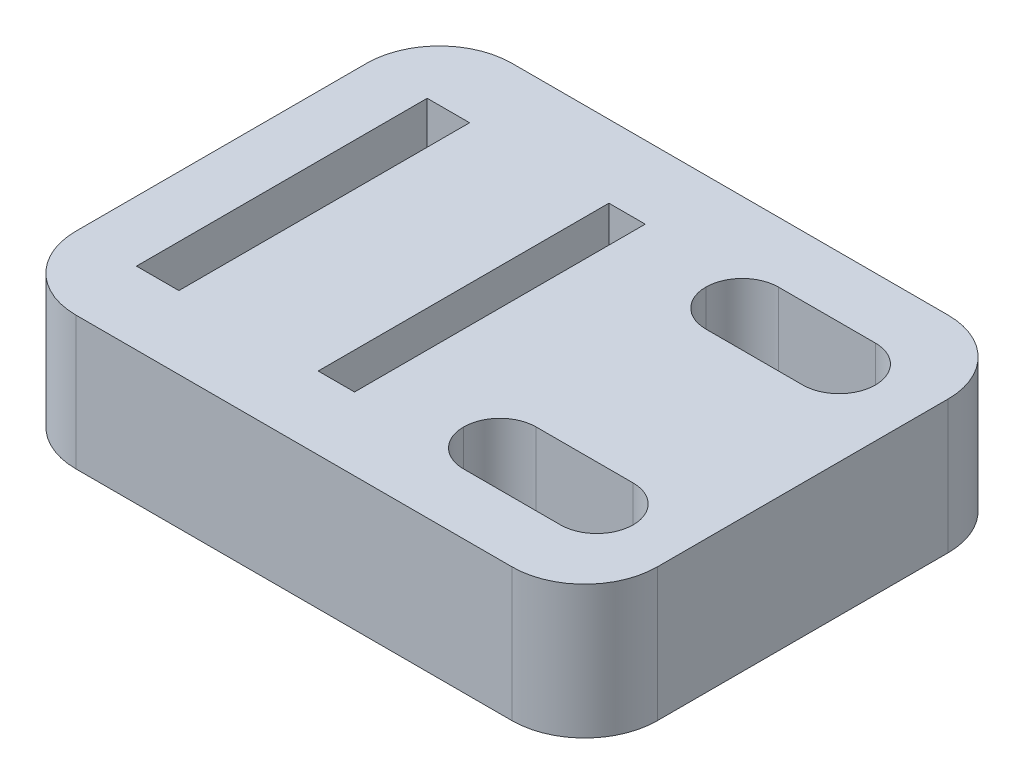
ISO-10303-21;
HEADER;
FILE_DESCRIPTION(('STEP AP214'),'2;1');
FILE_NAME('part.step','',(''),(''),'','','');
FILE_SCHEMA(('AUTOMOTIVE_DESIGN { 1 0 10303 214 1 1 1 1 }'));
ENDSEC;
DATA;
#1=APPLICATION_CONTEXT('core data for automotive mechanical design processes');
#2=APPLICATION_PROTOCOL_DEFINITION('international standard','automotive_design',2000,#1);
#3=PRODUCT_CONTEXT('',#1,'mechanical');
#4=PRODUCT('Part','Part','',(#3));
#5=PRODUCT_RELATED_PRODUCT_CATEGORY('part','',(#4));
#6=PRODUCT_DEFINITION_FORMATION('','',#4);
#7=PRODUCT_DEFINITION_CONTEXT('part definition',#1,'design');
#8=PRODUCT_DEFINITION('design','',#6,#7);
#9=PRODUCT_DEFINITION_SHAPE('','',#8);
#10=(LENGTH_UNIT() NAMED_UNIT(*) SI_UNIT(.MILLI.,.METRE.));
#11=(NAMED_UNIT(*) PLANE_ANGLE_UNIT() SI_UNIT($,.RADIAN.));
#12=(NAMED_UNIT(*) SI_UNIT($,.STERADIAN.) SOLID_ANGLE_UNIT());
#13=UNCERTAINTY_MEASURE_WITH_UNIT(LENGTH_MEASURE(1.E-05),#10,'distance_accuracy_value','');
#14=(GEOMETRIC_REPRESENTATION_CONTEXT(3) GLOBAL_UNCERTAINTY_ASSIGNED_CONTEXT((#13)) GLOBAL_UNIT_ASSIGNED_CONTEXT((#10,
#11,#12)) REPRESENTATION_CONTEXT('',''));
#15=CARTESIAN_POINT('',(0.,0.,0.));
#16=DIRECTION('',(0.,0.,1.));
#17=DIRECTION('',(1.,0.,0.));
#18=AXIS2_PLACEMENT_3D('',#15,#16,#17);
#19=CARTESIAN_POINT('',(0.,5.5,0.));
#20=DIRECTION('',(0.,1.,0.));
#21=DIRECTION('',(0.,0.,1.));
#22=AXIS2_PLACEMENT_3D('',#19,#20,#21);
#23=PLANE('',#22);
#24=DIRECTION('',(1.,0.,0.));
#25=VECTOR('',#24,1.);
#26=CARTESIAN_POINT('',(-9.,5.5,-12.5));
#27=LINE('',#26,#25);
#28=CARTESIAN_POINT('',(-7.5,5.5,-12.5));
#29=VERTEX_POINT('',#28);
#30=CARTESIAN_POINT('',(-3.5,5.5,-12.5));
#31=VERTEX_POINT('',#30);
#32=EDGE_CURVE('E424',#29,#31,#27,.T.);
#33=ORIENTED_EDGE('',*,*,#32,.F.);
#34=CARTESIAN_POINT('',(-7.5,5.5,-14.));
#35=DIRECTION('',(0.,1.,0.));
#36=DIRECTION('',(0.,0.,1.));
#37=AXIS2_PLACEMENT_3D('',#34,#35,#36);
#38=CIRCLE('',#37,1.5);
#39=CARTESIAN_POINT('',(-9.,5.5,-14.));
#40=VERTEX_POINT('',#39);
#41=EDGE_CURVE('E381',#29,#40,#38,.F.);
#42=ORIENTED_EDGE('',*,*,#41,.T.);
#43=CARTESIAN_POINT('',(-7.5,5.5,-14.));
#44=DIRECTION('',(0.,1.,0.));
#45=DIRECTION('',(0.,0.,1.));
#46=AXIS2_PLACEMENT_3D('',#43,#44,#45);
#47=CIRCLE('',#46,1.5);
#48=CARTESIAN_POINT('',(-7.5,5.5,-15.5));
#49=VERTEX_POINT('',#48);
#50=EDGE_CURVE('E371',#40,#49,#47,.F.);
#51=ORIENTED_EDGE('',*,*,#50,.T.);
#52=DIRECTION('',(-1.,0.,0.));
#53=VECTOR('',#52,1.);
#54=CARTESIAN_POINT('',(-9.,5.5,-15.5));
#55=LINE('',#54,#53);
#56=CARTESIAN_POINT('',(-3.5,5.5,-15.5));
#57=VERTEX_POINT('',#56);
#58=EDGE_CURVE('E252',#57,#49,#55,.T.);
#59=ORIENTED_EDGE('',*,*,#58,.F.);
#60=CARTESIAN_POINT('',(-3.5,5.5,-14.));
#61=DIRECTION('',(0.,1.,0.));
#62=DIRECTION('',(0.,0.,1.));
#63=AXIS2_PLACEMENT_3D('',#60,#61,#62);
#64=CIRCLE('',#63,1.5);
#65=CARTESIAN_POINT('',(-2.,5.5,-14.));
#66=VERTEX_POINT('',#65);
#67=EDGE_CURVE('E11',#57,#66,#64,.F.);
#68=ORIENTED_EDGE('',*,*,#67,.T.);
#69=CARTESIAN_POINT('',(-3.5,5.5,-14.));
#70=DIRECTION('',(0.,1.,0.));
#71=DIRECTION('',(0.,0.,1.));
#72=AXIS2_PLACEMENT_3D('',#69,#70,#71);
#73=CIRCLE('',#72,1.5);
#74=EDGE_CURVE('E407',#66,#31,#73,.F.);
#75=ORIENTED_EDGE('',*,*,#74,.T.);
#76=EDGE_LOOP('',(#33,#42,#51,#59,#68,#75));
#77=FACE_BOUND('',#76,.T.);
#78=DIRECTION('',(1.,0.,0.));
#79=VECTOR('',#78,1.);
#80=CARTESIAN_POINT('',(-14.,5.5,-3.));
#81=LINE('',#80,#79);
#82=CARTESIAN_POINT('',(-14.,5.5,-3.));
#83=VERTEX_POINT('',#82);
#84=CARTESIAN_POINT('',(-12.5,5.5,-3.));
#85=VERTEX_POINT('',#84);
#86=EDGE_CURVE('E265',#83,#85,#81,.T.);
#87=ORIENTED_EDGE('',*,*,#86,.F.);
#88=DIRECTION('',(0.,0.,1.));
#89=VECTOR('',#88,1.);
#90=CARTESIAN_POINT('',(-14.,5.5,-15.));
#91=LINE('',#90,#89);
#92=CARTESIAN_POINT('',(-14.,5.5,-15.));
#93=VERTEX_POINT('',#92);
#94=EDGE_CURVE('E263',#93,#83,#91,.T.);
#95=ORIENTED_EDGE('',*,*,#94,.F.);
#96=DIRECTION('',(-1.,0.,0.));
#97=VECTOR('',#96,1.);
#98=CARTESIAN_POINT('',(-14.,5.5,-15.));
#99=LINE('',#98,#97);
#100=CARTESIAN_POINT('',(-12.5,5.5,-15.));
#101=VERTEX_POINT('',#100);
#102=EDGE_CURVE('E271',#101,#93,#99,.T.);
#103=ORIENTED_EDGE('',*,*,#102,.F.);
#104=DIRECTION('',(0.,0.,-1.));
#105=VECTOR('',#104,1.);
#106=CARTESIAN_POINT('',(-12.5,5.5,-15.));
#107=LINE('',#106,#105);
#108=EDGE_CURVE('E268',#85,#101,#107,.T.);
#109=ORIENTED_EDGE('',*,*,#108,.F.);
#110=EDGE_LOOP('',(#87,#95,#103,#109));
#111=FACE_BOUND('',#110,.T.);
#112=DIRECTION('',(0.,0.,1.));
#113=VECTOR('',#112,1.);
#114=CARTESIAN_POINT('',(-24.,5.5,0.));
#115=LINE('',#114,#113);
#116=CARTESIAN_POINT('',(-24.,5.5,-15.));
#117=VERTEX_POINT('',#116);
#118=CARTESIAN_POINT('',(-24.,5.5,-3.));
#119=VERTEX_POINT('',#118);
#120=EDGE_CURVE('E301',#117,#119,#115,.T.);
#121=ORIENTED_EDGE('',*,*,#120,.T.);
#122=CARTESIAN_POINT('',(-21.,5.5,-3.));
#123=DIRECTION('',(0.,1.,0.));
#124=DIRECTION('',(0.,0.,1.));
#125=AXIS2_PLACEMENT_3D('',#122,#123,#124);
#126=CIRCLE('',#125,3.);
#127=CARTESIAN_POINT('',(-21.,5.5,0.));
#128=VERTEX_POINT('',#127);
#129=EDGE_CURVE('E344',#119,#128,#126,.T.);
#130=ORIENTED_EDGE('',*,*,#129,.T.);
#131=DIRECTION('',(1.,0.,0.));
#132=VECTOR('',#131,1.);
#133=CARTESIAN_POINT('',(0.,5.5,0.));
#134=LINE('',#133,#132);
#135=CARTESIAN_POINT('',(-3.,5.5,0.));
#136=VERTEX_POINT('',#135);
#137=EDGE_CURVE('E304',#128,#136,#134,.T.);
#138=ORIENTED_EDGE('',*,*,#137,.T.);
#139=CARTESIAN_POINT('',(-3.,5.5,-3.));
#140=DIRECTION('',(0.,1.,0.));
#141=DIRECTION('',(0.,0.,1.));
#142=AXIS2_PLACEMENT_3D('',#139,#140,#141);
#143=CIRCLE('',#142,3.);
#144=CARTESIAN_POINT('',(0.,5.5,-3.));
#145=VERTEX_POINT('',#144);
#146=EDGE_CURVE('E324',#136,#145,#143,.T.);
#147=ORIENTED_EDGE('',*,*,#146,.T.);
#148=DIRECTION('',(0.,0.,-1.));
#149=VECTOR('',#148,1.);
#150=CARTESIAN_POINT('',(0.,5.5,0.));
#151=LINE('',#150,#149);
#152=CARTESIAN_POINT('',(0.,5.5,-15.));
#153=VERTEX_POINT('',#152);
#154=EDGE_CURVE('E294',#145,#153,#151,.T.);
#155=ORIENTED_EDGE('',*,*,#154,.T.);
#156=CARTESIAN_POINT('',(-3.,5.5,-15.));
#157=DIRECTION('',(0.,1.,0.));
#158=DIRECTION('',(0.,0.,1.));
#159=AXIS2_PLACEMENT_3D('',#156,#157,#158);
#160=CIRCLE('',#159,3.);
#161=CARTESIAN_POINT('',(-3.,5.5,-18.));
#162=VERTEX_POINT('',#161);
#163=EDGE_CURVE('E340',#153,#162,#160,.T.);
#164=ORIENTED_EDGE('',*,*,#163,.T.);
#165=DIRECTION('',(-1.,0.,0.));
#166=VECTOR('',#165,1.);
#167=CARTESIAN_POINT('',(0.,5.5,-18.));
#168=LINE('',#167,#166);
#169=CARTESIAN_POINT('',(-21.,5.5,-18.));
#170=VERTEX_POINT('',#169);
#171=EDGE_CURVE('E297',#162,#170,#168,.T.);
#172=ORIENTED_EDGE('',*,*,#171,.T.);
#173=CARTESIAN_POINT('',(-21.,5.5,-15.));
#174=DIRECTION('',(0.,1.,0.));
#175=DIRECTION('',(0.,0.,1.));
#176=AXIS2_PLACEMENT_3D('',#173,#174,#175);
#177=CIRCLE('',#176,3.);
#178=EDGE_CURVE('E342',#170,#117,#177,.T.);
#179=ORIENTED_EDGE('',*,*,#178,.T.);
#180=EDGE_LOOP('',(#121,#130,#138,#147,#155,#164,#172,#179));
#181=FACE_BOUND('',#180,.T.);
#182=DIRECTION('',(1.,0.,0.));
#183=VECTOR('',#182,1.);
#184=CARTESIAN_POINT('',(-21.5,5.5,-3.));
#185=LINE('',#184,#183);
#186=CARTESIAN_POINT('',(-21.5,5.5,-3.));
#187=VERTEX_POINT('',#186);
#188=CARTESIAN_POINT('',(-19.75,5.5,-3.));
#189=VERTEX_POINT('',#188);
#190=EDGE_CURVE('E229',#187,#189,#185,.T.);
#191=ORIENTED_EDGE('',*,*,#190,.F.);
#192=DIRECTION('',(0.,0.,1.));
#193=VECTOR('',#192,1.);
#194=CARTESIAN_POINT('',(-21.5,5.5,-15.));
#195=LINE('',#194,#193);
#196=CARTESIAN_POINT('',(-21.5,5.5,-15.));
#197=VERTEX_POINT('',#196);
#198=EDGE_CURVE('E219',#197,#187,#195,.T.);
#199=ORIENTED_EDGE('',*,*,#198,.F.);
#200=DIRECTION('',(-1.,0.,0.));
#201=VECTOR('',#200,1.);
#202=CARTESIAN_POINT('',(-21.5,5.5,-15.));
#203=LINE('',#202,#201);
#204=CARTESIAN_POINT('',(-19.75,5.5,-15.));
#205=VERTEX_POINT('',#204);
#206=EDGE_CURVE('E245',#205,#197,#203,.T.);
#207=ORIENTED_EDGE('',*,*,#206,.F.);
#208=DIRECTION('',(0.,0.,-1.));
#209=VECTOR('',#208,1.);
#210=CARTESIAN_POINT('',(-19.75,5.5,-15.));
#211=LINE('',#210,#209);
#212=EDGE_CURVE('E243',#189,#205,#211,.T.);
#213=ORIENTED_EDGE('',*,*,#212,.F.);
#214=EDGE_LOOP('',(#191,#199,#207,#213));
#215=FACE_BOUND('',#214,.T.);
#216=DIRECTION('',(1.,0.,0.));
#217=VECTOR('',#216,1.);
#218=CARTESIAN_POINT('',(-9.,5.5,-2.5));
#219=LINE('',#218,#217);
#220=CARTESIAN_POINT('',(-7.5,5.5,-2.5));
#221=VERTEX_POINT('',#220);
#222=CARTESIAN_POINT('',(-3.5,5.5,-2.5));
#223=VERTEX_POINT('',#222);
#224=EDGE_CURVE('E446',#221,#223,#219,.T.);
#225=ORIENTED_EDGE('',*,*,#224,.F.);
#226=CARTESIAN_POINT('',(-7.5,5.5,-4.));
#227=DIRECTION('',(0.,1.,0.));
#228=DIRECTION('',(0.,0.,1.));
#229=AXIS2_PLACEMENT_3D('',#226,#227,#228);
#230=CIRCLE('',#229,1.5);
#231=CARTESIAN_POINT('',(-9.,5.5,-4.));
#232=VERTEX_POINT('',#231);
#233=EDGE_CURVE('E385',#221,#232,#230,.F.);
#234=ORIENTED_EDGE('',*,*,#233,.T.);
#235=CARTESIAN_POINT('',(-7.5,5.5,-4.));
#236=DIRECTION('',(0.,1.,0.));
#237=DIRECTION('',(0.,0.,1.));
#238=AXIS2_PLACEMENT_3D('',#235,#236,#237);
#239=CIRCLE('',#238,1.5);
#240=CARTESIAN_POINT('',(-7.5,5.5,-5.5));
#241=VERTEX_POINT('',#240);
#242=EDGE_CURVE('E376',#232,#241,#239,.F.);
#243=ORIENTED_EDGE('',*,*,#242,.T.);
#244=DIRECTION('',(-1.,0.,0.));
#245=VECTOR('',#244,1.);
#246=CARTESIAN_POINT('',(-9.,5.5,-5.5));
#247=LINE('',#246,#245);
#248=CARTESIAN_POINT('',(-3.5,5.5,-5.5));
#249=VERTEX_POINT('',#248);
#250=EDGE_CURVE('E445',#249,#241,#247,.T.);
#251=ORIENTED_EDGE('',*,*,#250,.F.);
#252=CARTESIAN_POINT('',(-3.5,5.5,-4.));
#253=DIRECTION('',(0.,1.,0.));
#254=DIRECTION('',(0.,0.,1.));
#255=AXIS2_PLACEMENT_3D('',#252,#253,#254);
#256=CIRCLE('',#255,1.5);
#257=CARTESIAN_POINT('',(-2.,5.5,-4.));
#258=VERTEX_POINT('',#257);
#259=EDGE_CURVE('E411',#249,#258,#256,.F.);
#260=ORIENTED_EDGE('',*,*,#259,.T.);
#261=CARTESIAN_POINT('',(-3.5,5.5,-4.));
#262=DIRECTION('',(0.,1.,0.));
#263=DIRECTION('',(0.,0.,1.));
#264=AXIS2_PLACEMENT_3D('',#261,#262,#263);
#265=CIRCLE('',#264,1.5);
#266=EDGE_CURVE('E390',#258,#223,#265,.F.);
#267=ORIENTED_EDGE('',*,*,#266,.T.);
#268=EDGE_LOOP('',(#225,#234,#243,#251,#260,#267));
#269=FACE_BOUND('',#268,.T.);
#270=ADVANCED_FACE('F33',(#77,#111,#181,#215,#269),#23,.T.);
#271=CARTESIAN_POINT('',(0.,0.,0.));
#272=DIRECTION('',(0.,1.,0.));
#273=DIRECTION('',(0.,0.,1.));
#274=AXIS2_PLACEMENT_3D('',#271,#272,#273);
#275=PLANE('',#274);
#276=CARTESIAN_POINT('',(-7.5,0.,-14.));
#277=DIRECTION('',(0.,1.,0.));
#278=DIRECTION('',(0.,0.,1.));
#279=AXIS2_PLACEMENT_3D('',#276,#277,#278);
#280=CIRCLE('',#279,1.5);
#281=CARTESIAN_POINT('',(-7.5,0.,-15.5));
#282=VERTEX_POINT('',#281);
#283=CARTESIAN_POINT('',(-9.,0.,-14.));
#284=VERTEX_POINT('',#283);
#285=EDGE_CURVE('E369',#282,#284,#280,.T.);
#286=ORIENTED_EDGE('',*,*,#285,.T.);
#287=CARTESIAN_POINT('',(-7.5,0.,-14.));
#288=DIRECTION('',(0.,1.,0.));
#289=DIRECTION('',(0.,0.,1.));
#290=AXIS2_PLACEMENT_3D('',#287,#288,#289);
#291=CIRCLE('',#290,1.5);
#292=CARTESIAN_POINT('',(-7.5,0.,-12.5));
#293=VERTEX_POINT('',#292);
#294=EDGE_CURVE('E379',#284,#293,#291,.T.);
#295=ORIENTED_EDGE('',*,*,#294,.T.);
#296=DIRECTION('',(1.,0.,0.));
#297=VECTOR('',#296,1.);
#298=CARTESIAN_POINT('',(-9.,0.,-12.5));
#299=LINE('',#298,#297);
#300=CARTESIAN_POINT('',(-3.5,0.,-12.5));
#301=VERTEX_POINT('',#300);
#302=EDGE_CURVE('E425',#293,#301,#299,.T.);
#303=ORIENTED_EDGE('',*,*,#302,.T.);
#304=CARTESIAN_POINT('',(-3.5,0.,-14.));
#305=DIRECTION('',(0.,1.,0.));
#306=DIRECTION('',(0.,0.,1.));
#307=AXIS2_PLACEMENT_3D('',#304,#305,#306);
#308=CIRCLE('',#307,1.5);
#309=CARTESIAN_POINT('',(-2.,0.,-14.));
#310=VERTEX_POINT('',#309);
#311=EDGE_CURVE('E55',#301,#310,#308,.T.);
#312=ORIENTED_EDGE('',*,*,#311,.T.);
#313=CARTESIAN_POINT('',(-3.5,0.,-14.));
#314=DIRECTION('',(0.,1.,0.));
#315=DIRECTION('',(0.,0.,1.));
#316=AXIS2_PLACEMENT_3D('',#313,#314,#315);
#317=CIRCLE('',#316,1.5);
#318=CARTESIAN_POINT('',(-3.5,0.,-15.5));
#319=VERTEX_POINT('',#318);
#320=EDGE_CURVE('E42',#310,#319,#317,.T.);
#321=ORIENTED_EDGE('',*,*,#320,.T.);
#322=DIRECTION('',(-1.,0.,0.));
#323=VECTOR('',#322,1.);
#324=CARTESIAN_POINT('',(-9.,0.,-15.5));
#325=LINE('',#324,#323);
#326=EDGE_CURVE('E416',#319,#282,#325,.T.);
#327=ORIENTED_EDGE('',*,*,#326,.T.);
#328=EDGE_LOOP('',(#286,#295,#303,#312,#321,#327));
#329=FACE_BOUND('',#328,.T.);
#330=DIRECTION('',(0.,0.,1.));
#331=VECTOR('',#330,1.);
#332=CARTESIAN_POINT('',(-14.,0.,-15.));
#333=LINE('',#332,#331);
#334=CARTESIAN_POINT('',(-14.,0.,-15.));
#335=VERTEX_POINT('',#334);
#336=CARTESIAN_POINT('',(-14.,0.,-3.));
#337=VERTEX_POINT('',#336);
#338=EDGE_CURVE('E237',#335,#337,#333,.T.);
#339=ORIENTED_EDGE('',*,*,#338,.T.);
#340=DIRECTION('',(1.,0.,0.));
#341=VECTOR('',#340,1.);
#342=CARTESIAN_POINT('',(-14.,0.,-3.));
#343=LINE('',#342,#341);
#344=CARTESIAN_POINT('',(-12.5,0.,-3.));
#345=VERTEX_POINT('',#344);
#346=EDGE_CURVE('E276',#337,#345,#343,.T.);
#347=ORIENTED_EDGE('',*,*,#346,.T.);
#348=DIRECTION('',(0.,0.,-1.));
#349=VECTOR('',#348,1.);
#350=CARTESIAN_POINT('',(-12.5,0.,-15.));
#351=LINE('',#350,#349);
#352=CARTESIAN_POINT('',(-12.5,0.,-15.));
#353=VERTEX_POINT('',#352);
#354=EDGE_CURVE('E279',#345,#353,#351,.T.);
#355=ORIENTED_EDGE('',*,*,#354,.T.);
#356=DIRECTION('',(-1.,0.,0.));
#357=VECTOR('',#356,1.);
#358=CARTESIAN_POINT('',(-14.,0.,-15.));
#359=LINE('',#358,#357);
#360=EDGE_CURVE('E266',#353,#335,#359,.T.);
#361=ORIENTED_EDGE('',*,*,#360,.T.);
#362=EDGE_LOOP('',(#339,#347,#355,#361));
#363=FACE_BOUND('',#362,.T.);
#364=DIRECTION('',(1.,0.,0.));
#365=VECTOR('',#364,1.);
#366=CARTESIAN_POINT('',(0.,0.,0.));
#367=LINE('',#366,#365);
#368=CARTESIAN_POINT('',(-21.,0.,0.));
#369=VERTEX_POINT('',#368);
#370=CARTESIAN_POINT('',(-3.,0.,0.));
#371=VERTEX_POINT('',#370);
#372=EDGE_CURVE('E298',#369,#371,#367,.T.);
#373=ORIENTED_EDGE('',*,*,#372,.F.);
#374=CARTESIAN_POINT('',(-21.,0.,-3.));
#375=DIRECTION('',(0.,1.,0.));
#376=DIRECTION('',(0.,0.,1.));
#377=AXIS2_PLACEMENT_3D('',#374,#375,#376);
#378=CIRCLE('',#377,3.);
#379=CARTESIAN_POINT('',(-24.,0.,-3.));
#380=VERTEX_POINT('',#379);
#381=EDGE_CURVE('E333',#369,#380,#378,.F.);
#382=ORIENTED_EDGE('',*,*,#381,.T.);
#383=DIRECTION('',(0.,0.,1.));
#384=VECTOR('',#383,1.);
#385=CARTESIAN_POINT('',(-24.,0.,0.));
#386=LINE('',#385,#384);
#387=CARTESIAN_POINT('',(-24.,0.,-15.));
#388=VERTEX_POINT('',#387);
#389=EDGE_CURVE('E312',#388,#380,#386,.T.);
#390=ORIENTED_EDGE('',*,*,#389,.F.);
#391=CARTESIAN_POINT('',(-21.,0.,-15.));
#392=DIRECTION('',(0.,1.,0.));
#393=DIRECTION('',(0.,0.,1.));
#394=AXIS2_PLACEMENT_3D('',#391,#392,#393);
#395=CIRCLE('',#394,3.);
#396=CARTESIAN_POINT('',(-21.,0.,-18.));
#397=VERTEX_POINT('',#396);
#398=EDGE_CURVE('E331',#388,#397,#395,.F.);
#399=ORIENTED_EDGE('',*,*,#398,.T.);
#400=DIRECTION('',(-1.,0.,0.));
#401=VECTOR('',#400,1.);
#402=CARTESIAN_POINT('',(0.,0.,-18.));
#403=LINE('',#402,#401);
#404=CARTESIAN_POINT('',(-3.,0.,-18.));
#405=VERTEX_POINT('',#404);
#406=EDGE_CURVE('E309',#405,#397,#403,.T.);
#407=ORIENTED_EDGE('',*,*,#406,.F.);
#408=CARTESIAN_POINT('',(-3.,0.,-15.));
#409=DIRECTION('',(0.,1.,0.));
#410=DIRECTION('',(0.,0.,1.));
#411=AXIS2_PLACEMENT_3D('',#408,#409,#410);
#412=CIRCLE('',#411,3.);
#413=CARTESIAN_POINT('',(0.,0.,-15.));
#414=VERTEX_POINT('',#413);
#415=EDGE_CURVE('E329',#405,#414,#412,.F.);
#416=ORIENTED_EDGE('',*,*,#415,.T.);
#417=DIRECTION('',(0.,0.,-1.));
#418=VECTOR('',#417,1.);
#419=CARTESIAN_POINT('',(0.,0.,0.));
#420=LINE('',#419,#418);
#421=CARTESIAN_POINT('',(0.,0.,-3.));
#422=VERTEX_POINT('',#421);
#423=EDGE_CURVE('E293',#422,#414,#420,.T.);
#424=ORIENTED_EDGE('',*,*,#423,.F.);
#425=CARTESIAN_POINT('',(-3.,0.,-3.));
#426=DIRECTION('',(0.,1.,0.));
#427=DIRECTION('',(0.,0.,1.));
#428=AXIS2_PLACEMENT_3D('',#425,#426,#427);
#429=CIRCLE('',#428,3.);
#430=EDGE_CURVE('E318',#422,#371,#429,.F.);
#431=ORIENTED_EDGE('',*,*,#430,.T.);
#432=EDGE_LOOP('',(#373,#382,#390,#399,#407,#416,#424,#431));
#433=FACE_BOUND('',#432,.T.);
#434=DIRECTION('',(0.,0.,1.));
#435=VECTOR('',#434,1.);
#436=CARTESIAN_POINT('',(-21.5,0.,-15.));
#437=LINE('',#436,#435);
#438=CARTESIAN_POINT('',(-21.5,0.,-15.));
#439=VERTEX_POINT('',#438);
#440=CARTESIAN_POINT('',(-21.5,0.,-3.));
#441=VERTEX_POINT('',#440);
#442=EDGE_CURVE('E250',#439,#441,#437,.T.);
#443=ORIENTED_EDGE('',*,*,#442,.T.);
#444=DIRECTION('',(1.,0.,0.));
#445=VECTOR('',#444,1.);
#446=CARTESIAN_POINT('',(-21.5,0.,-3.));
#447=LINE('',#446,#445);
#448=CARTESIAN_POINT('',(-19.75,0.,-3.));
#449=VERTEX_POINT('',#448);
#450=EDGE_CURVE('E236',#441,#449,#447,.T.);
#451=ORIENTED_EDGE('',*,*,#450,.T.);
#452=DIRECTION('',(0.,0.,-1.));
#453=VECTOR('',#452,1.);
#454=CARTESIAN_POINT('',(-19.75,0.,-15.));
#455=LINE('',#454,#453);
#456=CARTESIAN_POINT('',(-19.75,0.,-15.));
#457=VERTEX_POINT('',#456);
#458=EDGE_CURVE('E254',#449,#457,#455,.T.);
#459=ORIENTED_EDGE('',*,*,#458,.T.);
#460=DIRECTION('',(-1.,0.,0.));
#461=VECTOR('',#460,1.);
#462=CARTESIAN_POINT('',(-21.5,0.,-15.));
#463=LINE('',#462,#461);
#464=EDGE_CURVE('E230',#457,#439,#463,.T.);
#465=ORIENTED_EDGE('',*,*,#464,.T.);
#466=EDGE_LOOP('',(#443,#451,#459,#465));
#467=FACE_BOUND('',#466,.T.);
#468=CARTESIAN_POINT('',(-7.5,0.,-4.));
#469=DIRECTION('',(0.,1.,0.));
#470=DIRECTION('',(0.,0.,1.));
#471=AXIS2_PLACEMENT_3D('',#468,#469,#470);
#472=CIRCLE('',#471,1.5);
#473=CARTESIAN_POINT('',(-7.5,0.,-5.5));
#474=VERTEX_POINT('',#473);
#475=CARTESIAN_POINT('',(-9.,0.,-4.));
#476=VERTEX_POINT('',#475);
#477=EDGE_CURVE('E374',#474,#476,#472,.T.);
#478=ORIENTED_EDGE('',*,*,#477,.T.);
#479=CARTESIAN_POINT('',(-7.5,0.,-4.));
#480=DIRECTION('',(0.,1.,0.));
#481=DIRECTION('',(0.,0.,1.));
#482=AXIS2_PLACEMENT_3D('',#479,#480,#481);
#483=CIRCLE('',#482,1.5);
#484=CARTESIAN_POINT('',(-7.5,0.,-2.5));
#485=VERTEX_POINT('',#484);
#486=EDGE_CURVE('E383',#476,#485,#483,.T.);
#487=ORIENTED_EDGE('',*,*,#486,.T.);
#488=DIRECTION('',(1.,0.,0.));
#489=VECTOR('',#488,1.);
#490=CARTESIAN_POINT('',(-9.,0.,-2.5));
#491=LINE('',#490,#489);
#492=CARTESIAN_POINT('',(-3.5,0.,-2.5));
#493=VERTEX_POINT('',#492);
#494=EDGE_CURVE('E396',#485,#493,#491,.T.);
#495=ORIENTED_EDGE('',*,*,#494,.T.);
#496=CARTESIAN_POINT('',(-3.5,0.,-4.));
#497=DIRECTION('',(0.,1.,0.));
#498=DIRECTION('',(0.,0.,1.));
#499=AXIS2_PLACEMENT_3D('',#496,#497,#498);
#500=CIRCLE('',#499,1.5);
#501=CARTESIAN_POINT('',(-2.,0.,-4.));
#502=VERTEX_POINT('',#501);
#503=EDGE_CURVE('E387',#493,#502,#500,.T.);
#504=ORIENTED_EDGE('',*,*,#503,.T.);
#505=CARTESIAN_POINT('',(-3.5,0.,-4.));
#506=DIRECTION('',(0.,1.,0.));
#507=DIRECTION('',(0.,0.,1.));
#508=AXIS2_PLACEMENT_3D('',#505,#506,#507);
#509=CIRCLE('',#508,1.5);
#510=CARTESIAN_POINT('',(-3.5,0.,-5.5));
#511=VERTEX_POINT('',#510);
#512=EDGE_CURVE('E409',#502,#511,#509,.T.);
#513=ORIENTED_EDGE('',*,*,#512,.T.);
#514=DIRECTION('',(-1.,0.,0.));
#515=VECTOR('',#514,1.);
#516=CARTESIAN_POINT('',(-9.,0.,-5.5));
#517=LINE('',#516,#515);
#518=EDGE_CURVE('E442',#511,#474,#517,.T.);
#519=ORIENTED_EDGE('',*,*,#518,.T.);
#520=EDGE_LOOP('',(#478,#487,#495,#504,#513,#519));
#521=FACE_BOUND('',#520,.T.);
#522=ADVANCED_FACE('F414',(#329,#363,#433,#467,#521),#275,.F.);
#523=CARTESIAN_POINT('',(0.,5.5,0.));
#524=DIRECTION('',(-1.,0.,0.));
#525=DIRECTION('',(0.,0.,1.));
#526=AXIS2_PLACEMENT_3D('',#523,#524,#525);
#527=PLANE('',#526);
#528=ORIENTED_EDGE('',*,*,#423,.T.);
#529=DIRECTION('',(0.,-1.,0.));
#530=VECTOR('',#529,1.);
#531=CARTESIAN_POINT('',(0.,5.5,-15.));
#532=LINE('',#531,#530);
#533=EDGE_CURVE('E351',#414,#153,#532,.F.);
#534=ORIENTED_EDGE('',*,*,#533,.T.);
#535=ORIENTED_EDGE('',*,*,#154,.F.);
#536=DIRECTION('',(0.,-1.,0.));
#537=VECTOR('',#536,1.);
#538=CARTESIAN_POINT('',(0.,5.5,-3.));
#539=LINE('',#538,#537);
#540=EDGE_CURVE('E306',#145,#422,#539,.T.);
#541=ORIENTED_EDGE('',*,*,#540,.T.);
#542=EDGE_LOOP('',(#528,#534,#535,#541));
#543=FACE_BOUND('',#542,.T.);
#544=ADVANCED_FACE('F483',(#543),#527,.F.);
#545=CARTESIAN_POINT('',(0.,5.5,-18.));
#546=DIRECTION('',(0.,0.,1.));
#547=DIRECTION('',(1.,0.,0.));
#548=AXIS2_PLACEMENT_3D('',#545,#546,#547);
#549=PLANE('',#548);
#550=ORIENTED_EDGE('',*,*,#406,.T.);
#551=DIRECTION('',(0.,-1.,0.));
#552=VECTOR('',#551,1.);
#553=CARTESIAN_POINT('',(-21.,5.5,-18.));
#554=LINE('',#553,#552);
#555=EDGE_CURVE('E349',#397,#170,#554,.F.);
#556=ORIENTED_EDGE('',*,*,#555,.T.);
#557=ORIENTED_EDGE('',*,*,#171,.F.);
#558=DIRECTION('',(0.,-1.,0.));
#559=VECTOR('',#558,1.);
#560=CARTESIAN_POINT('',(-3.,5.5,-18.));
#561=LINE('',#560,#559);
#562=EDGE_CURVE('E346',#162,#405,#561,.T.);
#563=ORIENTED_EDGE('',*,*,#562,.T.);
#564=EDGE_LOOP('',(#550,#556,#557,#563));
#565=FACE_BOUND('',#564,.T.);
#566=ADVANCED_FACE('F496',(#565),#549,.F.);
#567=CARTESIAN_POINT('',(-24.,5.5,0.));
#568=DIRECTION('',(1.,0.,0.));
#569=DIRECTION('',(0.,0.,-1.));
#570=AXIS2_PLACEMENT_3D('',#567,#568,#569);
#571=PLANE('',#570);
#572=ORIENTED_EDGE('',*,*,#389,.T.);
#573=DIRECTION('',(0.,-1.,0.));
#574=VECTOR('',#573,1.);
#575=CARTESIAN_POINT('',(-24.,5.5,-3.));
#576=LINE('',#575,#574);
#577=EDGE_CURVE('E338',#380,#119,#576,.F.);
#578=ORIENTED_EDGE('',*,*,#577,.T.);
#579=ORIENTED_EDGE('',*,*,#120,.F.);
#580=DIRECTION('',(0.,-1.,0.));
#581=VECTOR('',#580,1.);
#582=CARTESIAN_POINT('',(-24.,5.5,-15.));
#583=LINE('',#582,#581);
#584=EDGE_CURVE('E335',#117,#388,#583,.T.);
#585=ORIENTED_EDGE('',*,*,#584,.T.);
#586=EDGE_LOOP('',(#572,#578,#579,#585));
#587=FACE_BOUND('',#586,.T.);
#588=ADVANCED_FACE('F492',(#587),#571,.F.);
#589=CARTESIAN_POINT('',(0.,5.5,0.));
#590=DIRECTION('',(0.,0.,-1.));
#591=DIRECTION('',(-1.,0.,0.));
#592=AXIS2_PLACEMENT_3D('',#589,#590,#591);
#593=PLANE('',#592);
#594=ORIENTED_EDGE('',*,*,#137,.F.);
#595=DIRECTION('',(0.,-1.,0.));
#596=VECTOR('',#595,1.);
#597=CARTESIAN_POINT('',(-21.,5.5,0.));
#598=LINE('',#597,#596);
#599=EDGE_CURVE('E326',#128,#369,#598,.T.);
#600=ORIENTED_EDGE('',*,*,#599,.T.);
#601=ORIENTED_EDGE('',*,*,#372,.T.);
#602=DIRECTION('',(0.,-1.,0.));
#603=VECTOR('',#602,1.);
#604=CARTESIAN_POINT('',(-3.,5.5,0.));
#605=LINE('',#604,#603);
#606=EDGE_CURVE('E321',#371,#136,#605,.F.);
#607=ORIENTED_EDGE('',*,*,#606,.T.);
#608=EDGE_LOOP('',(#594,#600,#601,#607));
#609=FACE_BOUND('',#608,.T.);
#610=ADVANCED_FACE('F489',(#609),#593,.F.);
#611=CARTESIAN_POINT('',(-14.,5.5,-15.));
#612=DIRECTION('',(1.,0.,0.));
#613=DIRECTION('',(0.,0.,-1.));
#614=AXIS2_PLACEMENT_3D('',#611,#612,#613);
#615=PLANE('',#614);
#616=ORIENTED_EDGE('',*,*,#338,.F.);
#617=DIRECTION('',(0.,-1.,0.));
#618=VECTOR('',#617,1.);
#619=CARTESIAN_POINT('',(-14.,5.5,-15.));
#620=LINE('',#619,#618);
#621=EDGE_CURVE('E273',#93,#335,#620,.T.);
#622=ORIENTED_EDGE('',*,*,#621,.F.);
#623=ORIENTED_EDGE('',*,*,#94,.T.);
#624=DIRECTION('',(0.,-1.,0.));
#625=VECTOR('',#624,1.);
#626=CARTESIAN_POINT('',(-14.,5.5,-3.));
#627=LINE('',#626,#625);
#628=EDGE_CURVE('E290',#83,#337,#627,.T.);
#629=ORIENTED_EDGE('',*,*,#628,.T.);
#630=EDGE_LOOP('',(#616,#622,#623,#629));
#631=FACE_BOUND('',#630,.T.);
#632=ADVANCED_FACE('F486',(#631),#615,.T.);
#633=CARTESIAN_POINT('',(-14.,5.5,-3.));
#634=DIRECTION('',(0.,0.,-1.));
#635=DIRECTION('',(-1.,0.,0.));
#636=AXIS2_PLACEMENT_3D('',#633,#634,#635);
#637=PLANE('',#636);
#638=ORIENTED_EDGE('',*,*,#346,.F.);
#639=ORIENTED_EDGE('',*,*,#628,.F.);
#640=ORIENTED_EDGE('',*,*,#86,.T.);
#641=DIRECTION('',(0.,-1.,0.));
#642=VECTOR('',#641,1.);
#643=CARTESIAN_POINT('',(-12.5,5.5,-3.));
#644=LINE('',#643,#642);
#645=EDGE_CURVE('E288',#85,#345,#644,.T.);
#646=ORIENTED_EDGE('',*,*,#645,.T.);
#647=EDGE_LOOP('',(#638,#639,#640,#646));
#648=FACE_BOUND('',#647,.T.);
#649=ADVANCED_FACE('F675',(#648),#637,.T.);
#650=CARTESIAN_POINT('',(-12.5,5.5,-15.));
#651=DIRECTION('',(-1.,0.,0.));
#652=DIRECTION('',(0.,0.,1.));
#653=AXIS2_PLACEMENT_3D('',#650,#651,#652);
#654=PLANE('',#653);
#655=ORIENTED_EDGE('',*,*,#354,.F.);
#656=ORIENTED_EDGE('',*,*,#645,.F.);
#657=ORIENTED_EDGE('',*,*,#108,.T.);
#658=DIRECTION('',(0.,-1.,0.));
#659=VECTOR('',#658,1.);
#660=CARTESIAN_POINT('',(-12.5,5.5,-15.));
#661=LINE('',#660,#659);
#662=EDGE_CURVE('E286',#101,#353,#661,.T.);
#663=ORIENTED_EDGE('',*,*,#662,.T.);
#664=EDGE_LOOP('',(#655,#656,#657,#663));
#665=FACE_BOUND('',#664,.T.);
#666=ADVANCED_FACE('F666',(#665),#654,.T.);
#667=CARTESIAN_POINT('',(-14.,5.5,-15.));
#668=DIRECTION('',(0.,0.,1.));
#669=DIRECTION('',(1.,0.,0.));
#670=AXIS2_PLACEMENT_3D('',#667,#668,#669);
#671=PLANE('',#670);
#672=ORIENTED_EDGE('',*,*,#360,.F.);
#673=ORIENTED_EDGE('',*,*,#662,.F.);
#674=ORIENTED_EDGE('',*,*,#102,.T.);
#675=ORIENTED_EDGE('',*,*,#621,.T.);
#676=EDGE_LOOP('',(#672,#673,#674,#675));
#677=FACE_BOUND('',#676,.T.);
#678=ADVANCED_FACE('F658',(#677),#671,.T.);
#679=CARTESIAN_POINT('',(-21.5,5.5,-15.));
#680=DIRECTION('',(1.,0.,0.));
#681=DIRECTION('',(0.,0.,-1.));
#682=AXIS2_PLACEMENT_3D('',#679,#680,#681);
#683=PLANE('',#682);
#684=ORIENTED_EDGE('',*,*,#442,.F.);
#685=DIRECTION('',(0.,-1.,0.));
#686=VECTOR('',#685,1.);
#687=CARTESIAN_POINT('',(-21.5,5.5,-15.));
#688=LINE('',#687,#686);
#689=EDGE_CURVE('E225',#197,#439,#688,.T.);
#690=ORIENTED_EDGE('',*,*,#689,.F.);
#691=ORIENTED_EDGE('',*,*,#198,.T.);
#692=DIRECTION('',(0.,-1.,0.));
#693=VECTOR('',#692,1.);
#694=CARTESIAN_POINT('',(-21.5,5.5,-3.));
#695=LINE('',#694,#693);
#696=EDGE_CURVE('E222',#187,#441,#695,.T.);
#697=ORIENTED_EDGE('',*,*,#696,.T.);
#698=EDGE_LOOP('',(#684,#690,#691,#697));
#699=FACE_BOUND('',#698,.T.);
#700=ADVANCED_FACE('F221',(#699),#683,.T.);
#701=CARTESIAN_POINT('',(-21.5,5.5,-3.));
#702=DIRECTION('',(0.,0.,-1.));
#703=DIRECTION('',(-1.,0.,0.));
#704=AXIS2_PLACEMENT_3D('',#701,#702,#703);
#705=PLANE('',#704);
#706=ORIENTED_EDGE('',*,*,#450,.F.);
#707=ORIENTED_EDGE('',*,*,#696,.F.);
#708=ORIENTED_EDGE('',*,*,#190,.T.);
#709=DIRECTION('',(0.,-1.,0.));
#710=VECTOR('',#709,1.);
#711=CARTESIAN_POINT('',(-19.75,5.5,-3.));
#712=LINE('',#711,#710);
#713=EDGE_CURVE('E238',#189,#449,#712,.T.);
#714=ORIENTED_EDGE('',*,*,#713,.T.);
#715=EDGE_LOOP('',(#706,#707,#708,#714));
#716=FACE_BOUND('',#715,.T.);
#717=ADVANCED_FACE('F233',(#716),#705,.T.);
#718=CARTESIAN_POINT('',(-19.75,5.5,-15.));
#719=DIRECTION('',(-1.,0.,0.));
#720=DIRECTION('',(0.,0.,1.));
#721=AXIS2_PLACEMENT_3D('',#718,#719,#720);
#722=PLANE('',#721);
#723=ORIENTED_EDGE('',*,*,#458,.F.);
#724=ORIENTED_EDGE('',*,*,#713,.F.);
#725=ORIENTED_EDGE('',*,*,#212,.T.);
#726=DIRECTION('',(0.,-1.,0.));
#727=VECTOR('',#726,1.);
#728=CARTESIAN_POINT('',(-19.75,5.5,-15.));
#729=LINE('',#728,#727);
#730=EDGE_CURVE('E260',#205,#457,#729,.T.);
#731=ORIENTED_EDGE('',*,*,#730,.T.);
#732=EDGE_LOOP('',(#723,#724,#725,#731));
#733=FACE_BOUND('',#732,.T.);
#734=ADVANCED_FACE('F634',(#733),#722,.T.);
#735=CARTESIAN_POINT('',(-21.5,5.5,-15.));
#736=DIRECTION('',(0.,0.,1.));
#737=DIRECTION('',(1.,0.,0.));
#738=AXIS2_PLACEMENT_3D('',#735,#736,#737);
#739=PLANE('',#738);
#740=ORIENTED_EDGE('',*,*,#464,.F.);
#741=ORIENTED_EDGE('',*,*,#730,.F.);
#742=ORIENTED_EDGE('',*,*,#206,.T.);
#743=ORIENTED_EDGE('',*,*,#689,.T.);
#744=EDGE_LOOP('',(#740,#741,#742,#743));
#745=FACE_BOUND('',#744,.T.);
#746=ADVANCED_FACE('F626',(#745),#739,.T.);
#747=CARTESIAN_POINT('',(-9.,5.5,-12.5));
#748=DIRECTION('',(0.,0.,-1.));
#749=DIRECTION('',(-1.,0.,0.));
#750=AXIS2_PLACEMENT_3D('',#747,#748,#749);
#751=PLANE('',#750);
#752=ORIENTED_EDGE('',*,*,#32,.T.);
#753=DIRECTION('',(0.,-1.,0.));
#754=VECTOR('',#753,1.);
#755=CARTESIAN_POINT('',(-3.5,0.,-12.5));
#756=LINE('',#755,#754);
#757=EDGE_CURVE('E392',#31,#301,#756,.T.);
#758=ORIENTED_EDGE('',*,*,#757,.T.);
#759=ORIENTED_EDGE('',*,*,#302,.F.);
#760=DIRECTION('',(0.,-1.,0.));
#761=VECTOR('',#760,1.);
#762=CARTESIAN_POINT('',(-7.5,5.5,-12.5));
#763=LINE('',#762,#761);
#764=EDGE_CURVE('E359',#293,#29,#763,.F.);
#765=ORIENTED_EDGE('',*,*,#764,.T.);
#766=EDGE_LOOP('',(#752,#758,#759,#765));
#767=FACE_BOUND('',#766,.T.);
#768=ADVANCED_FACE('F436',(#767),#751,.T.);
#769=CARTESIAN_POINT('',(-9.,5.5,-15.5));
#770=DIRECTION('',(0.,0.,1.));
#771=DIRECTION('',(1.,0.,0.));
#772=AXIS2_PLACEMENT_3D('',#769,#770,#771);
#773=PLANE('',#772);
#774=ORIENTED_EDGE('',*,*,#326,.F.);
#775=DIRECTION('',(0.,-1.,0.));
#776=VECTOR('',#775,1.);
#777=CARTESIAN_POINT('',(-3.5,5.5,-15.5));
#778=LINE('',#777,#776);
#779=EDGE_CURVE('E404',#319,#57,#778,.F.);
#780=ORIENTED_EDGE('',*,*,#779,.T.);
#781=ORIENTED_EDGE('',*,*,#58,.T.);
#782=DIRECTION('',(0.,-1.,0.));
#783=VECTOR('',#782,1.);
#784=CARTESIAN_POINT('',(-7.5,0.,-15.5));
#785=LINE('',#784,#783);
#786=EDGE_CURVE('E353',#49,#282,#785,.T.);
#787=ORIENTED_EDGE('',*,*,#786,.T.);
#788=EDGE_LOOP('',(#774,#780,#781,#787));
#789=FACE_BOUND('',#788,.T.);
#790=ADVANCED_FACE('F422',(#789),#773,.T.);
#791=CARTESIAN_POINT('',(-9.,5.5,-2.5));
#792=DIRECTION('',(0.,0.,-1.));
#793=DIRECTION('',(-1.,0.,0.));
#794=AXIS2_PLACEMENT_3D('',#791,#792,#793);
#795=PLANE('',#794);
#796=ORIENTED_EDGE('',*,*,#494,.F.);
#797=DIRECTION('',(0.,-1.,0.));
#798=VECTOR('',#797,1.);
#799=CARTESIAN_POINT('',(-7.5,5.5,-2.5));
#800=LINE('',#799,#798);
#801=EDGE_CURVE('E364',#485,#221,#800,.F.);
#802=ORIENTED_EDGE('',*,*,#801,.T.);
#803=ORIENTED_EDGE('',*,*,#224,.T.);
#804=DIRECTION('',(0.,-1.,0.));
#805=VECTOR('',#804,1.);
#806=CARTESIAN_POINT('',(-3.5,0.,-2.5));
#807=LINE('',#806,#805);
#808=EDGE_CURVE('E361',#223,#493,#807,.T.);
#809=ORIENTED_EDGE('',*,*,#808,.T.);
#810=EDGE_LOOP('',(#796,#802,#803,#809));
#811=FACE_BOUND('',#810,.T.);
#812=ADVANCED_FACE('F467',(#811),#795,.T.);
#813=CARTESIAN_POINT('',(-9.,5.5,-5.5));
#814=DIRECTION('',(0.,0.,1.));
#815=DIRECTION('',(1.,0.,0.));
#816=AXIS2_PLACEMENT_3D('',#813,#814,#815);
#817=PLANE('',#816);
#818=ORIENTED_EDGE('',*,*,#518,.F.);
#819=DIRECTION('',(0.,-1.,0.));
#820=VECTOR('',#819,1.);
#821=CARTESIAN_POINT('',(-3.5,5.5,-5.5));
#822=LINE('',#821,#820);
#823=EDGE_CURVE('E402',#511,#249,#822,.F.);
#824=ORIENTED_EDGE('',*,*,#823,.T.);
#825=ORIENTED_EDGE('',*,*,#250,.T.);
#826=DIRECTION('',(0.,-1.,0.));
#827=VECTOR('',#826,1.);
#828=CARTESIAN_POINT('',(-7.5,0.,-5.5));
#829=LINE('',#828,#827);
#830=EDGE_CURVE('E356',#241,#474,#829,.T.);
#831=ORIENTED_EDGE('',*,*,#830,.T.);
#832=EDGE_LOOP('',(#818,#824,#825,#831));
#833=FACE_BOUND('',#832,.T.);
#834=ADVANCED_FACE('F464',(#833),#817,.T.);
#835=CARTESIAN_POINT('',(-3.,5.5,-3.));
#836=DIRECTION('',(0.,-1.,0.));
#837=DIRECTION('',(0.,0.,-1.));
#838=AXIS2_PLACEMENT_3D('',#835,#836,#837);
#839=CYLINDRICAL_SURFACE('',#838,3.);
#840=ORIENTED_EDGE('',*,*,#146,.F.);
#841=ORIENTED_EDGE('',*,*,#606,.F.);
#842=ORIENTED_EDGE('',*,*,#430,.F.);
#843=ORIENTED_EDGE('',*,*,#540,.F.);
#844=EDGE_LOOP('',(#840,#841,#842,#843));
#845=FACE_BOUND('',#844,.T.);
#846=ADVANCED_FACE('F466',(#845),#839,.T.);
#847=CARTESIAN_POINT('',(-21.,5.5,-3.));
#848=DIRECTION('',(0.,-1.,0.));
#849=DIRECTION('',(0.,0.,-1.));
#850=AXIS2_PLACEMENT_3D('',#847,#848,#849);
#851=CYLINDRICAL_SURFACE('',#850,3.);
#852=ORIENTED_EDGE('',*,*,#129,.F.);
#853=ORIENTED_EDGE('',*,*,#577,.F.);
#854=ORIENTED_EDGE('',*,*,#381,.F.);
#855=ORIENTED_EDGE('',*,*,#599,.F.);
#856=EDGE_LOOP('',(#852,#853,#854,#855));
#857=FACE_BOUND('',#856,.T.);
#858=ADVANCED_FACE('F473',(#857),#851,.T.);
#859=CARTESIAN_POINT('',(-21.,5.5,-15.));
#860=DIRECTION('',(0.,-1.,0.));
#861=DIRECTION('',(0.,0.,-1.));
#862=AXIS2_PLACEMENT_3D('',#859,#860,#861);
#863=CYLINDRICAL_SURFACE('',#862,3.);
#864=ORIENTED_EDGE('',*,*,#178,.F.);
#865=ORIENTED_EDGE('',*,*,#555,.F.);
#866=ORIENTED_EDGE('',*,*,#398,.F.);
#867=ORIENTED_EDGE('',*,*,#584,.F.);
#868=EDGE_LOOP('',(#864,#865,#866,#867));
#869=FACE_BOUND('',#868,.T.);
#870=ADVANCED_FACE('F506',(#869),#863,.T.);
#871=CARTESIAN_POINT('',(-3.,5.5,-15.));
#872=DIRECTION('',(0.,-1.,0.));
#873=DIRECTION('',(0.,0.,-1.));
#874=AXIS2_PLACEMENT_3D('',#871,#872,#873);
#875=CYLINDRICAL_SURFACE('',#874,3.);
#876=ORIENTED_EDGE('',*,*,#163,.F.);
#877=ORIENTED_EDGE('',*,*,#533,.F.);
#878=ORIENTED_EDGE('',*,*,#415,.F.);
#879=ORIENTED_EDGE('',*,*,#562,.F.);
#880=EDGE_LOOP('',(#876,#877,#878,#879));
#881=FACE_BOUND('',#880,.T.);
#882=ADVANCED_FACE('F510',(#881),#875,.T.);
#883=CARTESIAN_POINT('',(-7.5,5.5,-14.));
#884=DIRECTION('',(0.,1.,0.));
#885=DIRECTION('',(0.,0.,1.));
#886=AXIS2_PLACEMENT_3D('',#883,#884,#885);
#887=CYLINDRICAL_SURFACE('',#886,1.5);
#888=DIRECTION('',(0.,-1.,0.));
#889=VECTOR('',#888,1.);
#890=CARTESIAN_POINT('',(-9.,0.,-14.));
#891=LINE('',#890,#889);
#892=EDGE_CURVE('E393',#40,#284,#891,.T.);
#893=ORIENTED_EDGE('',*,*,#892,.F.);
#894=ORIENTED_EDGE('',*,*,#41,.F.);
#895=ORIENTED_EDGE('',*,*,#764,.F.);
#896=ORIENTED_EDGE('',*,*,#294,.F.);
#897=EDGE_LOOP('',(#893,#894,#895,#896));
#898=FACE_BOUND('',#897,.T.);
#899=ADVANCED_FACE('F514',(#898),#887,.F.);
#900=CARTESIAN_POINT('',(-7.5,5.5,-14.));
#901=DIRECTION('',(0.,1.,0.));
#902=DIRECTION('',(0.,0.,1.));
#903=AXIS2_PLACEMENT_3D('',#900,#901,#902);
#904=CYLINDRICAL_SURFACE('',#903,1.5);
#905=ORIENTED_EDGE('',*,*,#50,.F.);
#906=ORIENTED_EDGE('',*,*,#892,.T.);
#907=ORIENTED_EDGE('',*,*,#285,.F.);
#908=ORIENTED_EDGE('',*,*,#786,.F.);
#909=EDGE_LOOP('',(#905,#906,#907,#908));
#910=FACE_BOUND('',#909,.T.);
#911=ADVANCED_FACE('F516',(#910),#904,.F.);
#912=CARTESIAN_POINT('',(-7.5,5.5,-4.));
#913=DIRECTION('',(0.,1.,0.));
#914=DIRECTION('',(0.,0.,1.));
#915=AXIS2_PLACEMENT_3D('',#912,#913,#914);
#916=CYLINDRICAL_SURFACE('',#915,1.5);
#917=DIRECTION('',(0.,-1.,0.));
#918=VECTOR('',#917,1.);
#919=CARTESIAN_POINT('',(-9.,0.,-4.));
#920=LINE('',#919,#918);
#921=EDGE_CURVE('E397',#232,#476,#920,.T.);
#922=ORIENTED_EDGE('',*,*,#921,.F.);
#923=ORIENTED_EDGE('',*,*,#233,.F.);
#924=ORIENTED_EDGE('',*,*,#801,.F.);
#925=ORIENTED_EDGE('',*,*,#486,.F.);
#926=EDGE_LOOP('',(#922,#923,#924,#925));
#927=FACE_BOUND('',#926,.T.);
#928=ADVANCED_FACE('F519',(#927),#916,.F.);
#929=CARTESIAN_POINT('',(-7.5,5.5,-4.));
#930=DIRECTION('',(0.,1.,0.));
#931=DIRECTION('',(0.,0.,1.));
#932=AXIS2_PLACEMENT_3D('',#929,#930,#931);
#933=CYLINDRICAL_SURFACE('',#932,1.5);
#934=ORIENTED_EDGE('',*,*,#242,.F.);
#935=ORIENTED_EDGE('',*,*,#921,.T.);
#936=ORIENTED_EDGE('',*,*,#477,.F.);
#937=ORIENTED_EDGE('',*,*,#830,.F.);
#938=EDGE_LOOP('',(#934,#935,#936,#937));
#939=FACE_BOUND('',#938,.T.);
#940=ADVANCED_FACE('F462',(#939),#933,.F.);
#941=CARTESIAN_POINT('',(-3.5,5.5,-4.));
#942=DIRECTION('',(0.,1.,0.));
#943=DIRECTION('',(0.,0.,1.));
#944=AXIS2_PLACEMENT_3D('',#941,#942,#943);
#945=CYLINDRICAL_SURFACE('',#944,1.5);
#946=ORIENTED_EDGE('',*,*,#266,.F.);
#947=DIRECTION('',(0.,-1.,0.));
#948=VECTOR('',#947,1.);
#949=CARTESIAN_POINT('',(-2.,5.5,-4.));
#950=LINE('',#949,#948);
#951=EDGE_CURVE('E366',#502,#258,#950,.F.);
#952=ORIENTED_EDGE('',*,*,#951,.F.);
#953=ORIENTED_EDGE('',*,*,#503,.F.);
#954=ORIENTED_EDGE('',*,*,#808,.F.);
#955=EDGE_LOOP('',(#946,#952,#953,#954));
#956=FACE_BOUND('',#955,.T.);
#957=ADVANCED_FACE('F526',(#956),#945,.F.);
#958=CARTESIAN_POINT('',(-3.5,5.5,-14.));
#959=DIRECTION('',(0.,1.,0.));
#960=DIRECTION('',(0.,0.,1.));
#961=AXIS2_PLACEMENT_3D('',#958,#959,#960);
#962=CYLINDRICAL_SURFACE('',#961,1.5);
#963=DIRECTION('',(0.,-1.,0.));
#964=VECTOR('',#963,1.);
#965=CARTESIAN_POINT('',(-2.,0.,-14.));
#966=LINE('',#965,#964);
#967=EDGE_CURVE('E37',#66,#310,#966,.T.);
#968=ORIENTED_EDGE('',*,*,#967,.F.);
#969=ORIENTED_EDGE('',*,*,#67,.F.);
#970=ORIENTED_EDGE('',*,*,#779,.F.);
#971=ORIENTED_EDGE('',*,*,#320,.F.);
#972=EDGE_LOOP('',(#968,#969,#970,#971));
#973=FACE_BOUND('',#972,.T.);
#974=ADVANCED_FACE('F426',(#973),#962,.F.);
#975=CARTESIAN_POINT('',(-3.5,5.5,-14.));
#976=DIRECTION('',(0.,1.,0.));
#977=DIRECTION('',(0.,0.,1.));
#978=AXIS2_PLACEMENT_3D('',#975,#976,#977);
#979=CYLINDRICAL_SURFACE('',#978,1.5);
#980=ORIENTED_EDGE('',*,*,#74,.F.);
#981=ORIENTED_EDGE('',*,*,#967,.T.);
#982=ORIENTED_EDGE('',*,*,#311,.F.);
#983=ORIENTED_EDGE('',*,*,#757,.F.);
#984=EDGE_LOOP('',(#980,#981,#982,#983));
#985=FACE_BOUND('',#984,.T.);
#986=ADVANCED_FACE('F430',(#985),#979,.F.);
#987=CARTESIAN_POINT('',(-3.5,5.5,-4.));
#988=DIRECTION('',(0.,1.,0.));
#989=DIRECTION('',(0.,0.,1.));
#990=AXIS2_PLACEMENT_3D('',#987,#988,#989);
#991=CYLINDRICAL_SURFACE('',#990,1.5);
#992=ORIENTED_EDGE('',*,*,#259,.F.);
#993=ORIENTED_EDGE('',*,*,#823,.F.);
#994=ORIENTED_EDGE('',*,*,#512,.F.);
#995=ORIENTED_EDGE('',*,*,#951,.T.);
#996=EDGE_LOOP('',(#992,#993,#994,#995));
#997=FACE_BOUND('',#996,.T.);
#998=ADVANCED_FACE('F35',(#997),#991,.F.);
#999=CLOSED_SHELL('',(#270,#522,#544,#566,#588,#610,#632,#649,#666,#678,#700,#717,#734,#746,
#768,#790,#812,#834,#846,#858,#870,#882,#899,#911,#928,#940,#957,#974,#986,#998));
#1000=MANIFOLD_SOLID_BREP('B2',#999);
#1001=ADVANCED_BREP_SHAPE_REPRESENTATION('',(#18,#1000),#14);
#1002=SHAPE_DEFINITION_REPRESENTATION(#9,#1001);
ENDSEC;
END-ISO-10303-21;
